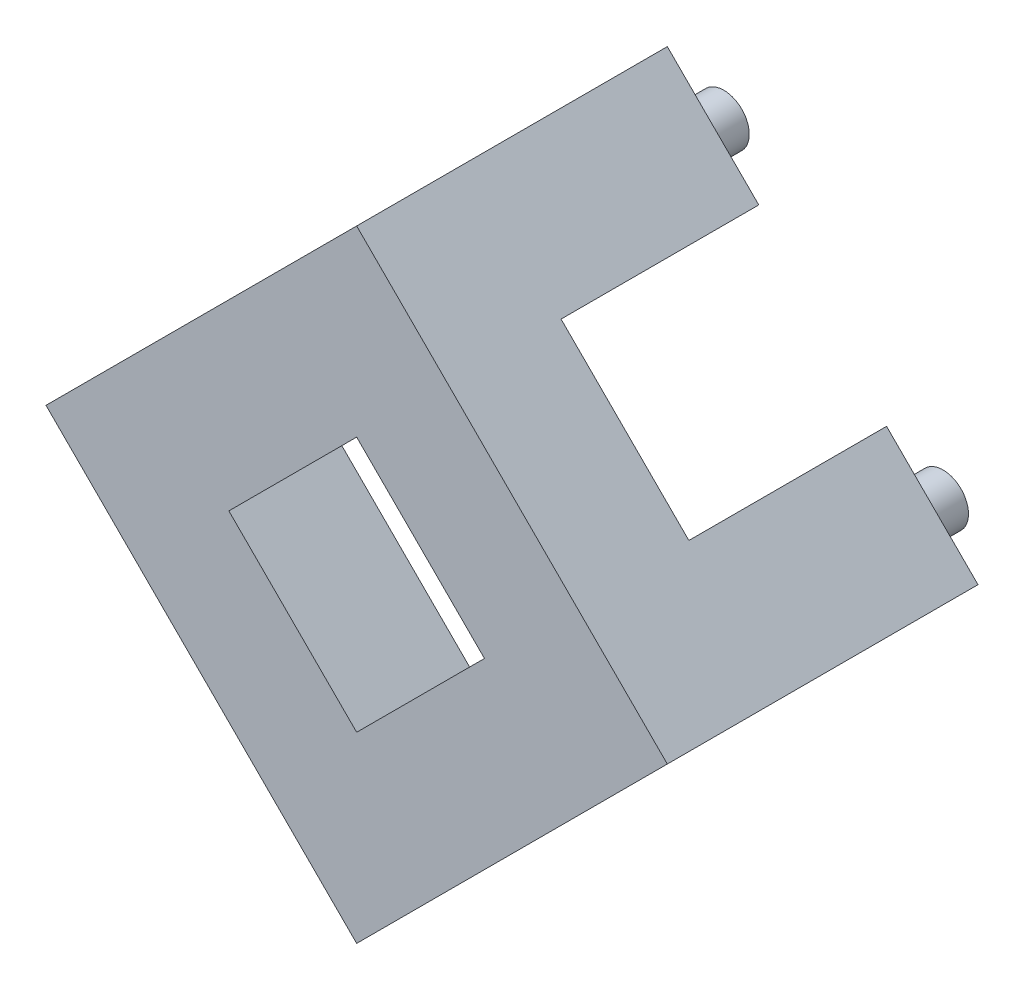
ISO-10303-21;
HEADER;
FILE_DESCRIPTION(('STEP AP214'),'2;1');
FILE_NAME('part.step','',(''),(''),'','','');
FILE_SCHEMA(('AUTOMOTIVE_DESIGN { 1 0 10303 214 1 1 1 1 }'));
ENDSEC;
DATA;
#1=APPLICATION_CONTEXT('core data for automotive mechanical design processes');
#2=APPLICATION_PROTOCOL_DEFINITION('international standard','automotive_design',2000,#1);
#3=PRODUCT_CONTEXT('',#1,'mechanical');
#4=PRODUCT('Part','Part','',(#3));
#5=PRODUCT_RELATED_PRODUCT_CATEGORY('part','',(#4));
#6=PRODUCT_DEFINITION_FORMATION('','',#4);
#7=PRODUCT_DEFINITION_CONTEXT('part definition',#1,'design');
#8=PRODUCT_DEFINITION('design','',#6,#7);
#9=PRODUCT_DEFINITION_SHAPE('','',#8);
#10=(LENGTH_UNIT() NAMED_UNIT(*) SI_UNIT(.MILLI.,.METRE.));
#11=(NAMED_UNIT(*) PLANE_ANGLE_UNIT() SI_UNIT($,.RADIAN.));
#12=(NAMED_UNIT(*) SI_UNIT($,.STERADIAN.) SOLID_ANGLE_UNIT());
#13=UNCERTAINTY_MEASURE_WITH_UNIT(LENGTH_MEASURE(1.E-05),#10,'distance_accuracy_value','');
#14=(GEOMETRIC_REPRESENTATION_CONTEXT(3) GLOBAL_UNCERTAINTY_ASSIGNED_CONTEXT((#13)) GLOBAL_UNIT_ASSIGNED_CONTEXT((#10,
#11,#12)) REPRESENTATION_CONTEXT('',''));
#15=CARTESIAN_POINT('',(0.,0.,0.));
#16=DIRECTION('',(0.,0.,1.));
#17=DIRECTION('',(1.,0.,0.));
#18=AXIS2_PLACEMENT_3D('',#15,#16,#17);
#19=CARTESIAN_POINT('',(-11.3137084989847,11.3137084989796,45.));
#20=DIRECTION('',(-0.707106781186707,0.707106781186388,0.));
#21=DIRECTION('',(-0.707106781186388,-0.707106781186707,0.));
#22=AXIS2_PLACEMENT_3D('',#19,#20,#21);
#23=PLANE('',#22);
#24=DIRECTION('',(0.,0.,1.));
#25=VECTOR('',#24,1.);
#26=CARTESIAN_POINT('',(-22.6274169979659,-6.74113542764587E-12,45.));
#27=LINE('',#26,#25);
#28=CARTESIAN_POINT('',(-22.6274169979659,-6.74113542764587E-12,45.));
#29=VERTEX_POINT('',#28);
#30=CARTESIAN_POINT('',(-22.6274169979659,-6.74113542764587E-12,65.));
#31=VERTEX_POINT('',#30);
#32=EDGE_CURVE('E414',#29,#31,#27,.T.);
#33=ORIENTED_EDGE('',*,*,#32,.F.);
#34=DIRECTION('',(-0.707106781186388,-0.707106781186707,0.));
#35=VECTOR('',#34,1.);
#36=CARTESIAN_POINT('',(-11.3137084989847,11.3137084989796,45.));
#37=LINE('',#36,#35);
#38=CARTESIAN_POINT('',(0.,22.6274169979694,45.));
#39=VERTEX_POINT('',#38);
#40=EDGE_CURVE('E275',#39,#29,#37,.T.);
#41=ORIENTED_EDGE('',*,*,#40,.F.);
#42=DIRECTION('',(0.,0.,1.));
#43=VECTOR('',#42,1.);
#44=CARTESIAN_POINT('',(0.,22.6274169979694,45.));
#45=LINE('',#44,#43);
#46=CARTESIAN_POINT('',(0.,22.6274169979694,65.));
#47=VERTEX_POINT('',#46);
#48=EDGE_CURVE('E279',#39,#47,#45,.T.);
#49=ORIENTED_EDGE('',*,*,#48,.T.);
#50=DIRECTION('',(-0.707106781186388,-0.707106781186707,0.));
#51=VECTOR('',#50,1.);
#52=CARTESIAN_POINT('',(-11.3137084989847,11.3137084989796,65.));
#53=LINE('',#52,#51);
#54=EDGE_CURVE('E269',#47,#31,#53,.T.);
#55=ORIENTED_EDGE('',*,*,#54,.T.);
#56=EDGE_LOOP('',(#33,#41,#49,#55));
#57=FACE_BOUND('',#56,.T.);
#58=ADVANCED_FACE('F107',(#57),#23,.F.);
#59=DIRECTION('',(0.707106781186786,0.707106781186309,0.));
#60=VECTOR('',#59,1.);
#61=CARTESIAN_POINT('',(-11.313708498972,11.3137084989796,45.));
#62=LINE('',#61,#60);
#63=CARTESIAN_POINT('',(-38.8137084989867,-16.1862915010166,45.));
#64=VERTEX_POINT('',#63);
#65=EDGE_CURVE('E238',#64,#29,#62,.T.);
#66=ORIENTED_EDGE('',*,*,#65,.F.);
#67=DIRECTION('',(0.,0.,1.));
#68=VECTOR('',#67,1.);
#69=CARTESIAN_POINT('',(-38.8137084989813,-16.186291501022,-35.7817459305204));
#70=LINE('',#69,#68);
#71=CARTESIAN_POINT('',(-38.8137084989813,-16.186291501022,10.));
#72=VERTEX_POINT('',#71);
#73=EDGE_CURVE('E249',#72,#64,#70,.T.);
#74=ORIENTED_EDGE('',*,*,#73,.F.);
#75=DIRECTION('',(-0.70710678118655,-0.707106781186545,0.));
#76=VECTOR('',#75,1.);
#77=CARTESIAN_POINT('',(-38.8137084989813,-16.186291501022,10.));
#78=LINE('',#77,#76);
#79=CARTESIAN_POINT('',(-22.6274169979659,-6.74227480844917E-12,10.));
#80=VERTEX_POINT('',#79);
#81=EDGE_CURVE('E267',#80,#72,#78,.T.);
#82=ORIENTED_EDGE('',*,*,#81,.F.);
#83=DIRECTION('',(0.,0.,1.));
#84=VECTOR('',#83,1.);
#85=CARTESIAN_POINT('',(-22.6274169979659,-6.74227480844917E-12,-35.7817459305204));
#86=LINE('',#85,#84);
#87=EDGE_CURVE('E251',#80,#29,#86,.T.);
#88=ORIENTED_EDGE('',*,*,#87,.T.);
#89=EDGE_LOOP('',(#66,#74,#82,#88));
#90=FACE_BOUND('',#89,.T.);
#91=ADVANCED_FACE('F247',(#90),#23,.F.);
#92=CARTESIAN_POINT('',(11.3137084989915,-11.3137084989864,45.));
#93=DIRECTION('',(0.707106781186707,-0.707106781186388,0.));
#94=DIRECTION('',(0.707106781186388,0.707106781186707,0.));
#95=AXIS2_PLACEMENT_3D('',#92,#93,#94);
#96=PLANE('',#95);
#97=DIRECTION('',(0.,0.,1.));
#98=VECTOR('',#97,1.);
#99=CARTESIAN_POINT('',(1.02123171030755E-11,-22.6274169979727,45.));
#100=LINE('',#99,#98);
#101=CARTESIAN_POINT('',(1.02123171030755E-11,-22.6274169979727,45.));
#102=VERTEX_POINT('',#101);
#103=CARTESIAN_POINT('',(1.02123171030755E-11,-22.6274169979727,65.));
#104=VERTEX_POINT('',#103);
#105=EDGE_CURVE('E122',#102,#104,#100,.T.);
#106=ORIENTED_EDGE('',*,*,#105,.T.);
#107=DIRECTION('',(0.707106781186388,0.707106781186707,0.));
#108=VECTOR('',#107,1.);
#109=CARTESIAN_POINT('',(11.3137084989915,-11.3137084989864,65.));
#110=LINE('',#109,#108);
#111=CARTESIAN_POINT('',(22.627416997971,-1.73472347597681E-12,65.));
#112=VERTEX_POINT('',#111);
#113=EDGE_CURVE('E417',#104,#112,#110,.T.);
#114=ORIENTED_EDGE('',*,*,#113,.T.);
#115=DIRECTION('',(0.,0.,1.));
#116=VECTOR('',#115,1.);
#117=CARTESIAN_POINT('',(22.6274169979762,3.4555691641458E-12,45.));
#118=LINE('',#117,#116);
#119=CARTESIAN_POINT('',(22.6274169979762,3.4555691641458E-12,45.));
#120=VERTEX_POINT('',#119);
#121=EDGE_CURVE('E263',#120,#112,#118,.T.);
#122=ORIENTED_EDGE('',*,*,#121,.F.);
#123=DIRECTION('',(0.707106781186388,0.707106781186707,0.));
#124=VECTOR('',#123,1.);
#125=CARTESIAN_POINT('',(11.3137084989915,-11.3137084989864,45.));
#126=LINE('',#125,#124);
#127=EDGE_CURVE('E423',#102,#120,#126,.T.);
#128=ORIENTED_EDGE('',*,*,#127,.F.);
#129=EDGE_LOOP('',(#106,#114,#122,#128));
#130=FACE_BOUND('',#129,.T.);
#131=ADVANCED_FACE('F474',(#130),#96,.F.);
#132=DIRECTION('',(-0.707106781186544,-0.707106781186551,0.));
#133=VECTOR('',#132,1.);
#134=CARTESIAN_POINT('',(11.3137084989915,-11.3137084989913,45.));
#135=LINE('',#134,#133);
#136=CARTESIAN_POINT('',(-16.186291501005,-38.813708498988,45.));
#137=VERTEX_POINT('',#136);
#138=EDGE_CURVE('E240',#102,#137,#135,.T.);
#139=ORIENTED_EDGE('',*,*,#138,.F.);
#140=DIRECTION('',(0.,0.,1.));
#141=VECTOR('',#140,1.);
#142=CARTESIAN_POINT('',(1.02103323420298E-11,-22.6274169979727,-35.7817459305204));
#143=LINE('',#142,#141);
#144=CARTESIAN_POINT('',(1.02103323420298E-11,-22.6274169979727,10.));
#145=VERTEX_POINT('',#144);
#146=EDGE_CURVE('E403',#145,#102,#143,.T.);
#147=ORIENTED_EDGE('',*,*,#146,.F.);
#148=DIRECTION('',(0.707106781186544,0.707106781186551,0.));
#149=VECTOR('',#148,1.);
#150=CARTESIAN_POINT('',(1.02103323420298E-11,-22.6274169979727,10.));
#151=LINE('',#150,#149);
#152=CARTESIAN_POINT('',(-16.186291501005,-38.813708498988,10.));
#153=VERTEX_POINT('',#152);
#154=EDGE_CURVE('E400',#153,#145,#151,.T.);
#155=ORIENTED_EDGE('',*,*,#154,.F.);
#156=DIRECTION('',(0.,0.,1.));
#157=VECTOR('',#156,1.);
#158=CARTESIAN_POINT('',(-16.186291501005,-38.813708498988,-35.7817459305204));
#159=LINE('',#158,#157);
#160=EDGE_CURVE('E130',#153,#137,#159,.T.);
#161=ORIENTED_EDGE('',*,*,#160,.T.);
#162=EDGE_LOOP('',(#139,#147,#155,#161));
#163=FACE_BOUND('',#162,.T.);
#164=ADVANCED_FACE('F527',(#163),#96,.F.);
#165=CARTESIAN_POINT('',(-16.1862915010152,38.8137084989848,-35.7817459305204));
#166=DIRECTION('',(-0.70710678118655,-0.707106781186545,0.));
#167=DIRECTION('',(0.707106781186545,-0.70710678118655,0.));
#168=AXIS2_PLACEMENT_3D('',#165,#166,#167);
#169=PLANE('',#168);
#170=DIRECTION('',(-0.707106781186707,0.707106781186388,0.));
#171=VECTOR('',#170,1.);
#172=CARTESIAN_POINT('',(11.3137084989847,11.3137084989898,45.));
#173=LINE('',#172,#171);
#174=EDGE_CURVE('E306',#120,#39,#173,.T.);
#175=ORIENTED_EDGE('',*,*,#174,.F.);
#176=ORIENTED_EDGE('',*,*,#121,.T.);
#177=DIRECTION('',(0.707106781186545,-0.70710678118655,0.));
#178=VECTOR('',#177,1.);
#179=CARTESIAN_POINT('',(-16.1862915010152,38.8137084989848,65.));
#180=LINE('',#179,#178);
#181=EDGE_CURVE('E323',#47,#112,#180,.T.);
#182=ORIENTED_EDGE('',*,*,#181,.F.);
#183=ORIENTED_EDGE('',*,*,#48,.F.);
#184=EDGE_LOOP('',(#175,#176,#182,#183));
#185=FACE_BOUND('',#184,.T.);
#186=ADVANCED_FACE('F451',(#185),#169,.T.);
#187=DIRECTION('',(0.,0.,1.));
#188=VECTOR('',#187,1.);
#189=CARTESIAN_POINT('',(38.8137084989915,-16.1862915010117,-35.7817459305204));
#190=LINE('',#189,#188);
#191=CARTESIAN_POINT('',(38.8137084989915,-16.1862915010117,10.));
#192=VERTEX_POINT('',#191);
#193=CARTESIAN_POINT('',(38.8137084989915,-16.1862915010117,45.));
#194=VERTEX_POINT('',#193);
#195=EDGE_CURVE('E298',#192,#194,#190,.T.);
#196=ORIENTED_EDGE('',*,*,#195,.T.);
#197=DIRECTION('',(-0.707106781186551,0.707106781186544,0.));
#198=VECTOR('',#197,1.);
#199=CARTESIAN_POINT('',(11.3137084989897,11.3137084989898,45.));
#200=LINE('',#199,#198);
#201=EDGE_CURVE('E421',#194,#120,#200,.T.);
#202=ORIENTED_EDGE('',*,*,#201,.T.);
#203=DIRECTION('',(0.,0.,1.));
#204=VECTOR('',#203,1.);
#205=CARTESIAN_POINT('',(22.6274169979762,3.45046803861719E-12,-35.7817459305204));
#206=LINE('',#205,#204);
#207=CARTESIAN_POINT('',(22.6274169979762,3.45046803861719E-12,10.));
#208=VERTEX_POINT('',#207);
#209=EDGE_CURVE('E300',#208,#120,#206,.T.);
#210=ORIENTED_EDGE('',*,*,#209,.F.);
#211=DIRECTION('',(-0.707106781186551,0.707106781186544,0.));
#212=VECTOR('',#211,1.);
#213=CARTESIAN_POINT('',(22.6274169979762,3.45046803861719E-12,10.));
#214=LINE('',#213,#212);
#215=EDGE_CURVE('E288',#192,#208,#214,.T.);
#216=ORIENTED_EDGE('',*,*,#215,.F.);
#217=EDGE_LOOP('',(#196,#202,#210,#216));
#218=FACE_BOUND('',#217,.T.);
#219=ADVANCED_FACE('F526',(#218),#169,.T.);
#220=DIRECTION('',(0.,0.,1.));
#221=VECTOR('',#220,1.);
#222=CARTESIAN_POINT('',(0.,22.6274169979694,-35.7817459305204));
#223=LINE('',#222,#221);
#224=CARTESIAN_POINT('',(0.,22.6274169979694,10.));
#225=VERTEX_POINT('',#224);
#226=EDGE_CURVE('E336',#225,#39,#223,.T.);
#227=ORIENTED_EDGE('',*,*,#226,.T.);
#228=DIRECTION('',(0.707106781186545,-0.70710678118655,0.));
#229=VECTOR('',#228,1.);
#230=CARTESIAN_POINT('',(11.3137084989847,11.3137084989846,45.));
#231=LINE('',#230,#229);
#232=CARTESIAN_POINT('',(-16.1862915010152,38.8137084989848,45.));
#233=VERTEX_POINT('',#232);
#234=EDGE_CURVE('E277',#233,#39,#231,.T.);
#235=ORIENTED_EDGE('',*,*,#234,.F.);
#236=DIRECTION('',(0.,0.,1.));
#237=VECTOR('',#236,1.);
#238=CARTESIAN_POINT('',(-16.1862915010152,38.8137084989848,-35.7817459305204));
#239=LINE('',#238,#237);
#240=CARTESIAN_POINT('',(-16.1862915010152,38.8137084989848,10.));
#241=VERTEX_POINT('',#240);
#242=EDGE_CURVE('E339',#241,#233,#239,.T.);
#243=ORIENTED_EDGE('',*,*,#242,.F.);
#244=DIRECTION('',(-0.707106781186545,0.70710678118655,0.));
#245=VECTOR('',#244,1.);
#246=CARTESIAN_POINT('',(-16.1862915010152,38.8137084989848,10.));
#247=LINE('',#246,#245);
#248=EDGE_CURVE('E327',#225,#241,#247,.T.);
#249=ORIENTED_EDGE('',*,*,#248,.F.);
#250=EDGE_LOOP('',(#227,#235,#243,#249));
#251=FACE_BOUND('',#250,.T.);
#252=ADVANCED_FACE('F379',(#251),#169,.T.);
#253=CARTESIAN_POINT('',(16.1862915010155,38.8137084989848,-35.7817459305204));
#254=DIRECTION('',(0.707106781186541,0.707106781186555,0.));
#255=DIRECTION('',(-0.707106781186555,0.707106781186541,0.));
#256=AXIS2_PLACEMENT_3D('',#253,#254,#255);
#257=PLANE('',#256);
#258=DIRECTION('',(0.707106781186555,-0.707106781186541,0.));
#259=VECTOR('',#258,1.);
#260=CARTESIAN_POINT('',(16.1862915010155,38.8137084989848,10.));
#261=LINE('',#260,#259);
#262=CARTESIAN_POINT('',(0.,55.,10.));
#263=VERTEX_POINT('',#262);
#264=CARTESIAN_POINT('',(16.1862915010155,38.8137084989848,10.));
#265=VERTEX_POINT('',#264);
#266=EDGE_CURVE('E332',#263,#265,#261,.T.);
#267=ORIENTED_EDGE('',*,*,#266,.F.);
#268=DIRECTION('',(0.,0.,1.));
#269=VECTOR('',#268,1.);
#270=CARTESIAN_POINT('',(0.,55.,-35.7817459305204));
#271=LINE('',#270,#269);
#272=CARTESIAN_POINT('',(0.,55.,65.));
#273=VERTEX_POINT('',#272);
#274=EDGE_CURVE('E326',#263,#273,#271,.T.);
#275=ORIENTED_EDGE('',*,*,#274,.T.);
#276=DIRECTION('',(-0.707106781186554,0.707106781186541,0.));
#277=VECTOR('',#276,1.);
#278=CARTESIAN_POINT('',(16.1862915010155,38.8137084989848,65.));
#279=LINE('',#278,#277);
#280=CARTESIAN_POINT('',(55.0000000000067,3.45933972717764E-12,65.));
#281=VERTEX_POINT('',#280);
#282=EDGE_CURVE('E318',#281,#273,#279,.T.);
#283=ORIENTED_EDGE('',*,*,#282,.F.);
#284=DIRECTION('',(0.,0.,1.));
#285=VECTOR('',#284,1.);
#286=CARTESIAN_POINT('',(55.0000000000067,3.45933972717764E-12,-35.7817459305204));
#287=LINE('',#286,#285);
#288=CARTESIAN_POINT('',(55.0000000000067,3.46250805804971E-12,10.));
#289=VERTEX_POINT('',#288);
#290=EDGE_CURVE('E291',#289,#281,#287,.T.);
#291=ORIENTED_EDGE('',*,*,#290,.F.);
#292=DIRECTION('',(0.707106781186548,-0.707106781186548,0.));
#293=VECTOR('',#292,1.);
#294=CARTESIAN_POINT('',(55.0000000000067,3.45933972717764E-12,10.));
#295=LINE('',#294,#293);
#296=CARTESIAN_POINT('',(38.8137084989915,16.1862915010187,10.));
#297=VERTEX_POINT('',#296);
#298=EDGE_CURVE('E293',#297,#289,#295,.T.);
#299=ORIENTED_EDGE('',*,*,#298,.F.);
#300=DIRECTION('',(0.,0.,1.));
#301=VECTOR('',#300,1.);
#302=CARTESIAN_POINT('',(38.8137084989915,16.1862915010187,-35.7817459305204));
#303=LINE('',#302,#301);
#304=CARTESIAN_POINT('',(38.8137084989915,16.1862915010187,45.));
#305=VERTEX_POINT('',#304);
#306=EDGE_CURVE('E287',#297,#305,#303,.T.);
#307=ORIENTED_EDGE('',*,*,#306,.T.);
#308=DIRECTION('',(0.707106781186702,-0.707106781186393,0.));
#309=VECTOR('',#308,1.);
#310=CARTESIAN_POINT('',(27.4999999999966,27.5000000000086,45.));
#311=LINE('',#310,#309);
#312=CARTESIAN_POINT('',(16.1862915010155,38.8137084989848,45.));
#313=VERTEX_POINT('',#312);
#314=EDGE_CURVE('E312',#313,#305,#311,.T.);
#315=ORIENTED_EDGE('',*,*,#314,.F.);
#316=DIRECTION('',(0.,0.,1.));
#317=VECTOR('',#316,1.);
#318=CARTESIAN_POINT('',(16.1862915010155,38.8137084989848,-35.7817459305204));
#319=LINE('',#318,#317);
#320=EDGE_CURVE('E330',#265,#313,#319,.T.);
#321=ORIENTED_EDGE('',*,*,#320,.F.);
#322=EDGE_LOOP('',(#267,#275,#283,#291,#299,#307,#315,#321));
#323=FACE_BOUND('',#322,.T.);
#324=ADVANCED_FACE('F109',(#323),#257,.T.);
#325=CARTESIAN_POINT('',(0.,22.6274169979694,-35.7817459305204));
#326=DIRECTION('',(0.707106781186545,-0.70710678118655,0.));
#327=DIRECTION('',(0.70710678118655,0.707106781186545,0.));
#328=AXIS2_PLACEMENT_3D('',#325,#326,#327);
#329=PLANE('',#328);
#330=DIRECTION('',(0.70710678118655,0.707106781186545,0.));
#331=VECTOR('',#330,1.);
#332=CARTESIAN_POINT('',(-11.3137084989847,11.3137084989848,45.));
#333=LINE('',#332,#331);
#334=EDGE_CURVE('E315',#39,#313,#333,.T.);
#335=ORIENTED_EDGE('',*,*,#334,.F.);
#336=ORIENTED_EDGE('',*,*,#226,.F.);
#337=DIRECTION('',(-0.70710678118655,-0.707106781186545,0.));
#338=VECTOR('',#337,1.);
#339=CARTESIAN_POINT('',(0.,22.6274169979694,10.));
#340=LINE('',#339,#338);
#341=EDGE_CURVE('E329',#265,#225,#340,.T.);
#342=ORIENTED_EDGE('',*,*,#341,.F.);
#343=ORIENTED_EDGE('',*,*,#320,.T.);
#344=EDGE_LOOP('',(#335,#336,#342,#343));
#345=FACE_BOUND('',#344,.T.);
#346=ADVANCED_FACE('F370',(#345),#329,.T.);
#347=CARTESIAN_POINT('',(0.,55.,-35.7817459305204));
#348=DIRECTION('',(-0.707106781186548,0.707106781186547,0.));
#349=DIRECTION('',(-0.707106781186547,-0.707106781186548,0.));
#350=AXIS2_PLACEMENT_3D('',#347,#348,#349);
#351=PLANE('',#350);
#352=DIRECTION('',(0.707106781186547,0.707106781186548,0.));
#353=VECTOR('',#352,1.);
#354=CARTESIAN_POINT('',(0.,55.,10.));
#355=LINE('',#354,#353);
#356=EDGE_CURVE('E334',#241,#263,#355,.T.);
#357=ORIENTED_EDGE('',*,*,#356,.F.);
#358=ORIENTED_EDGE('',*,*,#242,.T.);
#359=DIRECTION('',(0.707106781186387,0.707106781186708,0.));
#360=VECTOR('',#359,1.);
#361=CARTESIAN_POINT('',(-27.5000000000037,27.4999999999912,45.));
#362=LINE('',#361,#360);
#363=CARTESIAN_POINT('',(-38.8137084989813,16.1862915010084,45.));
#364=VERTEX_POINT('',#363);
#365=EDGE_CURVE('E270',#364,#233,#362,.T.);
#366=ORIENTED_EDGE('',*,*,#365,.F.);
#367=DIRECTION('',(0.,0.,1.));
#368=VECTOR('',#367,1.);
#369=CARTESIAN_POINT('',(-38.8137084989813,16.1862915010084,-35.7817459305204));
#370=LINE('',#369,#368);
#371=CARTESIAN_POINT('',(-38.8137084989813,16.1862915010084,10.));
#372=VERTEX_POINT('',#371);
#373=EDGE_CURVE('E261',#372,#364,#370,.T.);
#374=ORIENTED_EDGE('',*,*,#373,.F.);
#375=DIRECTION('',(0.707106781186548,0.707106781186547,0.));
#376=VECTOR('',#375,1.);
#377=CARTESIAN_POINT('',(-38.8137084989813,16.1862915010084,10.));
#378=LINE('',#377,#376);
#379=CARTESIAN_POINT('',(-54.9999999999965,-6.75848266240564E-12,10.));
#380=VERTEX_POINT('',#379);
#381=EDGE_CURVE('E434',#380,#372,#378,.T.);
#382=ORIENTED_EDGE('',*,*,#381,.F.);
#383=DIRECTION('',(0.,0.,1.));
#384=VECTOR('',#383,1.);
#385=CARTESIAN_POINT('',(-54.9999999999965,-6.75511099502498E-12,-35.7817459305204));
#386=LINE('',#385,#384);
#387=CARTESIAN_POINT('',(-54.9999999999965,-6.75511099502498E-12,65.));
#388=VERTEX_POINT('',#387);
#389=EDGE_CURVE('E395',#380,#388,#386,.T.);
#390=ORIENTED_EDGE('',*,*,#389,.T.);
#391=DIRECTION('',(-0.707106781186547,-0.707106781186548,0.));
#392=VECTOR('',#391,1.);
#393=CARTESIAN_POINT('',(0.,55.,65.));
#394=LINE('',#393,#392);
#395=EDGE_CURVE('E321',#273,#388,#394,.T.);
#396=ORIENTED_EDGE('',*,*,#395,.F.);
#397=ORIENTED_EDGE('',*,*,#274,.F.);
#398=EDGE_LOOP('',(#357,#358,#366,#374,#382,#390,#396,#397));
#399=FACE_BOUND('',#398,.T.);
#400=ADVANCED_FACE('F358',(#399),#351,.T.);
#401=CARTESIAN_POINT('',(0.,0.,10.));
#402=DIRECTION('',(0.,0.,1.));
#403=DIRECTION('',(1.,0.,0.));
#404=AXIS2_PLACEMENT_3D('',#401,#402,#403);
#405=PLANE('',#404);
#406=CARTESIAN_POINT('',(0.,38.8137084989848,10.));
#407=DIRECTION('',(0.,0.,1.));
#408=DIRECTION('',(1.,0.,0.));
#409=AXIS2_PLACEMENT_3D('',#406,#407,#408);
#410=CIRCLE('',#409,4.5);
#411=CARTESIAN_POINT('',(4.49999999999998,38.8137084989848,10.));
#412=VERTEX_POINT('',#411);
#413=EDGE_CURVE('E115',#412,#412,#410,.F.);
#414=ORIENTED_EDGE('',*,*,#413,.F.);
#415=EDGE_LOOP('',(#414));
#416=FACE_BOUND('',#415,.T.);
#417=ORIENTED_EDGE('',*,*,#266,.T.);
#418=ORIENTED_EDGE('',*,*,#341,.T.);
#419=ORIENTED_EDGE('',*,*,#248,.T.);
#420=ORIENTED_EDGE('',*,*,#356,.T.);
#421=EDGE_LOOP('',(#417,#418,#419,#420));
#422=FACE_BOUND('',#421,.T.);
#423=ADVANCED_FACE('F354',(#416,#422),#405,.F.);
#424=CARTESIAN_POINT('',(0.,0.,65.));
#425=DIRECTION('',(0.,0.,1.));
#426=DIRECTION('',(1.,0.,0.));
#427=AXIS2_PLACEMENT_3D('',#424,#425,#426);
#428=PLANE('',#427);
#429=DIRECTION('',(0.707106781186707,-0.707106781186388,0.));
#430=VECTOR('',#429,1.);
#431=CARTESIAN_POINT('',(-11.3137084989812,-11.3137084989863,65.));
#432=LINE('',#431,#430);
#433=EDGE_CURVE('E253',#31,#104,#432,.T.);
#434=ORIENTED_EDGE('',*,*,#433,.F.);
#435=ORIENTED_EDGE('',*,*,#54,.F.);
#436=ORIENTED_EDGE('',*,*,#181,.T.);
#437=ORIENTED_EDGE('',*,*,#113,.F.);
#438=EDGE_LOOP('',(#434,#435,#436,#437));
#439=FACE_BOUND('',#438,.T.);
#440=ORIENTED_EDGE('',*,*,#282,.T.);
#441=ORIENTED_EDGE('',*,*,#395,.T.);
#442=DIRECTION('',(0.707106781186548,-0.707106781186547,0.));
#443=VECTOR('',#442,1.);
#444=CARTESIAN_POINT('',(-54.9999999999965,-6.75511099502498E-12,65.));
#445=LINE('',#444,#443);
#446=CARTESIAN_POINT('',(1.02211862795979E-11,-55.0000000000033,65.));
#447=VERTEX_POINT('',#446);
#448=EDGE_CURVE('E259',#388,#447,#445,.T.);
#449=ORIENTED_EDGE('',*,*,#448,.T.);
#450=DIRECTION('',(0.707106781186548,0.707106781186547,0.));
#451=VECTOR('',#450,1.);
#452=CARTESIAN_POINT('',(38.8137084989915,-16.1862915010117,65.));
#453=LINE('',#452,#451);
#454=EDGE_CURVE('E284',#447,#281,#453,.T.);
#455=ORIENTED_EDGE('',*,*,#454,.T.);
#456=EDGE_LOOP('',(#440,#441,#449,#455));
#457=FACE_BOUND('',#456,.T.);
#458=ADVANCED_FACE('F357',(#439,#457),#428,.T.);
#459=CARTESIAN_POINT('',(0.,0.,45.));
#460=DIRECTION('',(0.,0.,1.));
#461=DIRECTION('',(1.,0.,0.));
#462=AXIS2_PLACEMENT_3D('',#459,#460,#461);
#463=PLANE('',#462);
#464=ORIENTED_EDGE('',*,*,#174,.T.);
#465=ORIENTED_EDGE('',*,*,#334,.T.);
#466=ORIENTED_EDGE('',*,*,#314,.T.);
#467=DIRECTION('',(-0.707106781186551,-0.707106781186545,0.));
#468=VECTOR('',#467,1.);
#469=CARTESIAN_POINT('',(11.3137084989863,-11.3137084989864,45.));
#470=LINE('',#469,#468);
#471=EDGE_CURVE('E309',#305,#120,#470,.T.);
#472=ORIENTED_EDGE('',*,*,#471,.T.);
#473=EDGE_LOOP('',(#464,#465,#466,#472));
#474=FACE_BOUND('',#473,.T.);
#475=ADVANCED_FACE('F375',(#474),#463,.F.);
#476=CARTESIAN_POINT('',(38.8137084989915,16.1862915010187,-35.7817459305204));
#477=DIRECTION('',(-0.707106781186545,0.70710678118655,0.));
#478=DIRECTION('',(-0.70710678118655,-0.707106781186545,0.));
#479=AXIS2_PLACEMENT_3D('',#476,#477,#478);
#480=PLANE('',#479);
#481=ORIENTED_EDGE('',*,*,#471,.F.);
#482=ORIENTED_EDGE('',*,*,#306,.F.);
#483=DIRECTION('',(0.70710678118655,0.707106781186545,0.));
#484=VECTOR('',#483,1.);
#485=CARTESIAN_POINT('',(38.8137084989915,16.1862915010187,10.));
#486=LINE('',#485,#484);
#487=EDGE_CURVE('E295',#208,#297,#486,.T.);
#488=ORIENTED_EDGE('',*,*,#487,.F.);
#489=ORIENTED_EDGE('',*,*,#209,.T.);
#490=EDGE_LOOP('',(#481,#482,#488,#489));
#491=FACE_BOUND('',#490,.T.);
#492=ADVANCED_FACE('F515',(#491),#480,.T.);
#493=CARTESIAN_POINT('',(38.8137084989915,-16.1862915010117,-35.7817459305204));
#494=DIRECTION('',(0.707106781186547,-0.707106781186548,0.));
#495=DIRECTION('',(0.707106781186548,0.707106781186547,0.));
#496=AXIS2_PLACEMENT_3D('',#493,#494,#495);
#497=PLANE('',#496);
#498=DIRECTION('',(-0.707106781186548,-0.707106781186547,0.));
#499=VECTOR('',#498,1.);
#500=CARTESIAN_POINT('',(38.8137084989915,-16.1862915010117,10.));
#501=LINE('',#500,#499);
#502=EDGE_CURVE('E290',#289,#192,#501,.T.);
#503=ORIENTED_EDGE('',*,*,#502,.F.);
#504=ORIENTED_EDGE('',*,*,#290,.T.);
#505=ORIENTED_EDGE('',*,*,#454,.F.);
#506=DIRECTION('',(0.,0.,1.));
#507=VECTOR('',#506,1.);
#508=CARTESIAN_POINT('',(1.02211862795979E-11,-55.0000000000033,-35.7817459305204));
#509=LINE('',#508,#507);
#510=CARTESIAN_POINT('',(1.02244601674073E-11,-55.0000000000033,10.));
#511=VERTEX_POINT('',#510);
#512=EDGE_CURVE('E397',#511,#447,#509,.T.);
#513=ORIENTED_EDGE('',*,*,#512,.F.);
#514=DIRECTION('',(-0.707106781186548,-0.707106781186548,0.));
#515=VECTOR('',#514,1.);
#516=CARTESIAN_POINT('',(1.02211862795979E-11,-55.0000000000033,10.));
#517=LINE('',#516,#515);
#518=CARTESIAN_POINT('',(16.1862915010254,-38.813708498988,10.));
#519=VERTEX_POINT('',#518);
#520=EDGE_CURVE('E406',#519,#511,#517,.T.);
#521=ORIENTED_EDGE('',*,*,#520,.F.);
#522=DIRECTION('',(0.,0.,1.));
#523=VECTOR('',#522,1.);
#524=CARTESIAN_POINT('',(16.1862915010254,-38.813708498988,-35.7817459305204));
#525=LINE('',#524,#523);
#526=CARTESIAN_POINT('',(16.1862915010254,-38.813708498988,45.));
#527=VERTEX_POINT('',#526);
#528=EDGE_CURVE('E411',#519,#527,#525,.T.);
#529=ORIENTED_EDGE('',*,*,#528,.T.);
#530=DIRECTION('',(-0.707106781186388,-0.707106781186707,0.));
#531=VECTOR('',#530,1.);
#532=CARTESIAN_POINT('',(27.5000000000104,-27.499999999998,45.));
#533=LINE('',#532,#531);
#534=EDGE_CURVE('E418',#194,#527,#533,.T.);
#535=ORIENTED_EDGE('',*,*,#534,.F.);
#536=ORIENTED_EDGE('',*,*,#195,.F.);
#537=EDGE_LOOP('',(#503,#504,#505,#513,#521,#529,#535,#536));
#538=FACE_BOUND('',#537,.T.);
#539=ADVANCED_FACE('F390',(#538),#497,.T.);
#540=CARTESIAN_POINT('',(0.,0.,10.));
#541=DIRECTION('',(0.,0.,1.));
#542=DIRECTION('',(1.,0.,0.));
#543=AXIS2_PLACEMENT_3D('',#540,#541,#542);
#544=PLANE('',#543);
#545=CARTESIAN_POINT('',(38.8137084989848,0.,10.));
#546=DIRECTION('',(0.,0.,1.));
#547=DIRECTION('',(1.,0.,0.));
#548=AXIS2_PLACEMENT_3D('',#545,#546,#547);
#549=CIRCLE('',#548,4.5);
#550=CARTESIAN_POINT('',(43.3137084989848,0.,10.));
#551=VERTEX_POINT('',#550);
#552=EDGE_CURVE('E347',#551,#551,#549,.F.);
#553=ORIENTED_EDGE('',*,*,#552,.F.);
#554=EDGE_LOOP('',(#553));
#555=FACE_BOUND('',#554,.T.);
#556=ORIENTED_EDGE('',*,*,#298,.T.);
#557=ORIENTED_EDGE('',*,*,#502,.T.);
#558=ORIENTED_EDGE('',*,*,#215,.T.);
#559=ORIENTED_EDGE('',*,*,#487,.T.);
#560=EDGE_LOOP('',(#556,#557,#558,#559));
#561=FACE_BOUND('',#560,.T.);
#562=ADVANCED_FACE('F509',(#555,#561),#544,.F.);
#563=CARTESIAN_POINT('',(0.,0.,45.));
#564=DIRECTION('',(0.,0.,1.));
#565=DIRECTION('',(1.,0.,0.));
#566=AXIS2_PLACEMENT_3D('',#563,#564,#565);
#567=PLANE('',#566);
#568=ORIENTED_EDGE('',*,*,#365,.T.);
#569=ORIENTED_EDGE('',*,*,#234,.T.);
#570=ORIENTED_EDGE('',*,*,#40,.T.);
#571=DIRECTION('',(-0.707106781186551,0.707106781186544,0.));
#572=VECTOR('',#571,1.);
#573=CARTESIAN_POINT('',(-11.3137084989862,-11.3137084989863,45.));
#574=LINE('',#573,#572);
#575=EDGE_CURVE('E272',#29,#364,#574,.T.);
#576=ORIENTED_EDGE('',*,*,#575,.T.);
#577=EDGE_LOOP('',(#568,#569,#570,#576));
#578=FACE_BOUND('',#577,.T.);
#579=ADVANCED_FACE('F444',(#578),#567,.F.);
#580=CARTESIAN_POINT('',(-22.6274169979659,-6.74227480844917E-12,-35.7817459305204));
#581=DIRECTION('',(0.707106781186544,0.707106781186551,0.));
#582=DIRECTION('',(-0.707106781186551,0.707106781186544,0.));
#583=AXIS2_PLACEMENT_3D('',#580,#581,#582);
#584=PLANE('',#583);
#585=ORIENTED_EDGE('',*,*,#575,.F.);
#586=ORIENTED_EDGE('',*,*,#87,.F.);
#587=DIRECTION('',(0.707106781186551,-0.707106781186544,0.));
#588=VECTOR('',#587,1.);
#589=CARTESIAN_POINT('',(-22.6274169979659,-6.74227480844917E-12,10.));
#590=LINE('',#589,#588);
#591=EDGE_CURVE('E432',#372,#80,#590,.T.);
#592=ORIENTED_EDGE('',*,*,#591,.F.);
#593=ORIENTED_EDGE('',*,*,#373,.T.);
#594=EDGE_LOOP('',(#585,#586,#592,#593));
#595=FACE_BOUND('',#594,.T.);
#596=ADVANCED_FACE('F441',(#595),#584,.T.);
#597=CARTESIAN_POINT('',(-54.9999999999965,-6.75511099502498E-12,-35.7817459305204));
#598=DIRECTION('',(-0.707106781186547,-0.707106781186548,0.));
#599=DIRECTION('',(0.707106781186548,-0.707106781186547,0.));
#600=AXIS2_PLACEMENT_3D('',#597,#598,#599);
#601=PLANE('',#600);
#602=DIRECTION('',(-0.707106781186548,0.707106781186547,0.));
#603=VECTOR('',#602,1.);
#604=CARTESIAN_POINT('',(-54.9999999999965,-6.75511099502498E-12,10.));
#605=LINE('',#604,#603);
#606=EDGE_CURVE('E258',#72,#380,#605,.T.);
#607=ORIENTED_EDGE('',*,*,#606,.F.);
#608=ORIENTED_EDGE('',*,*,#73,.T.);
#609=DIRECTION('',(-0.707106781186707,0.707106781186388,0.));
#610=VECTOR('',#609,1.);
#611=CARTESIAN_POINT('',(-27.4999999999929,-27.5000000000053,45.));
#612=LINE('',#611,#610);
#613=EDGE_CURVE('E234',#137,#64,#612,.T.);
#614=ORIENTED_EDGE('',*,*,#613,.F.);
#615=ORIENTED_EDGE('',*,*,#160,.F.);
#616=DIRECTION('',(-0.707106781186547,0.707106781186548,0.));
#617=VECTOR('',#616,1.);
#618=CARTESIAN_POINT('',(-16.186291501005,-38.813708498988,10.));
#619=LINE('',#618,#617);
#620=EDGE_CURVE('E398',#511,#153,#619,.T.);
#621=ORIENTED_EDGE('',*,*,#620,.F.);
#622=ORIENTED_EDGE('',*,*,#512,.T.);
#623=ORIENTED_EDGE('',*,*,#448,.F.);
#624=ORIENTED_EDGE('',*,*,#389,.F.);
#625=EDGE_LOOP('',(#607,#608,#614,#615,#621,#622,#623,#624));
#626=FACE_BOUND('',#625,.T.);
#627=ADVANCED_FACE('F256',(#626),#601,.T.);
#628=CARTESIAN_POINT('',(0.,0.,10.));
#629=DIRECTION('',(0.,0.,1.));
#630=DIRECTION('',(1.,0.,0.));
#631=AXIS2_PLACEMENT_3D('',#628,#629,#630);
#632=PLANE('',#631);
#633=CARTESIAN_POINT('',(-38.8137084989848,0.,10.));
#634=DIRECTION('',(0.,0.,1.));
#635=DIRECTION('',(1.,0.,0.));
#636=AXIS2_PLACEMENT_3D('',#633,#634,#635);
#637=CIRCLE('',#636,4.5);
#638=CARTESIAN_POINT('',(-34.3137084989848,0.,10.));
#639=VERTEX_POINT('',#638);
#640=EDGE_CURVE('E12',#639,#639,#637,.F.);
#641=ORIENTED_EDGE('',*,*,#640,.F.);
#642=EDGE_LOOP('',(#641));
#643=FACE_BOUND('',#642,.T.);
#644=ORIENTED_EDGE('',*,*,#606,.T.);
#645=ORIENTED_EDGE('',*,*,#381,.T.);
#646=ORIENTED_EDGE('',*,*,#591,.T.);
#647=ORIENTED_EDGE('',*,*,#81,.T.);
#648=EDGE_LOOP('',(#644,#645,#646,#647));
#649=FACE_BOUND('',#648,.T.);
#650=ADVANCED_FACE('F577',(#643,#649),#632,.F.);
#651=CARTESIAN_POINT('',(0.,0.,45.));
#652=DIRECTION('',(0.,0.,1.));
#653=DIRECTION('',(1.,0.,0.));
#654=AXIS2_PLACEMENT_3D('',#651,#652,#653);
#655=PLANE('',#654);
#656=ORIENTED_EDGE('',*,*,#534,.T.);
#657=DIRECTION('',(-0.707106781186545,0.70710678118655,0.));
#658=VECTOR('',#657,1.);
#659=CARTESIAN_POINT('',(-11.3137084989812,-11.3137084989812,45.));
#660=LINE('',#659,#658);
#661=EDGE_CURVE('E426',#527,#102,#660,.T.);
#662=ORIENTED_EDGE('',*,*,#661,.T.);
#663=ORIENTED_EDGE('',*,*,#127,.T.);
#664=ORIENTED_EDGE('',*,*,#201,.F.);
#665=EDGE_LOOP('',(#656,#662,#663,#664));
#666=FACE_BOUND('',#665,.T.);
#667=ADVANCED_FACE('F472',(#666),#655,.F.);
#668=CARTESIAN_POINT('',(16.1862915010254,-38.813708498988,-35.7817459305204));
#669=DIRECTION('',(0.70710678118655,0.707106781186545,0.));
#670=DIRECTION('',(-0.707106781186545,0.70710678118655,0.));
#671=AXIS2_PLACEMENT_3D('',#668,#669,#670);
#672=PLANE('',#671);
#673=ORIENTED_EDGE('',*,*,#661,.F.);
#674=ORIENTED_EDGE('',*,*,#528,.F.);
#675=DIRECTION('',(0.707106781186545,-0.70710678118655,0.));
#676=VECTOR('',#675,1.);
#677=CARTESIAN_POINT('',(16.1862915010254,-38.813708498988,10.));
#678=LINE('',#677,#676);
#679=EDGE_CURVE('E415',#145,#519,#678,.T.);
#680=ORIENTED_EDGE('',*,*,#679,.F.);
#681=ORIENTED_EDGE('',*,*,#146,.T.);
#682=EDGE_LOOP('',(#673,#674,#680,#681));
#683=FACE_BOUND('',#682,.T.);
#684=ADVANCED_FACE('F469',(#683),#672,.T.);
#685=CARTESIAN_POINT('',(0.,0.,10.));
#686=DIRECTION('',(0.,0.,1.));
#687=DIRECTION('',(1.,0.,0.));
#688=AXIS2_PLACEMENT_3D('',#685,#686,#687);
#689=PLANE('',#688);
#690=CARTESIAN_POINT('',(0.,-38.8137084989848,10.));
#691=DIRECTION('',(0.,0.,1.));
#692=DIRECTION('',(1.,0.,0.));
#693=AXIS2_PLACEMENT_3D('',#690,#691,#692);
#694=CIRCLE('',#693,4.5);
#695=CARTESIAN_POINT('',(4.5,-38.8137084989848,10.));
#696=VERTEX_POINT('',#695);
#697=EDGE_CURVE('E344',#696,#696,#694,.F.);
#698=ORIENTED_EDGE('',*,*,#697,.F.);
#699=EDGE_LOOP('',(#698));
#700=FACE_BOUND('',#699,.T.);
#701=ORIENTED_EDGE('',*,*,#520,.T.);
#702=ORIENTED_EDGE('',*,*,#620,.T.);
#703=ORIENTED_EDGE('',*,*,#154,.T.);
#704=ORIENTED_EDGE('',*,*,#679,.T.);
#705=EDGE_LOOP('',(#701,#702,#703,#704));
#706=FACE_BOUND('',#705,.T.);
#707=ADVANCED_FACE('F464',(#700,#706),#689,.F.);
#708=CARTESIAN_POINT('',(-11.3137084989812,-11.3137084989863,45.));
#709=DIRECTION('',(-0.707106781186388,-0.707106781186707,0.));
#710=DIRECTION('',(0.707106781186707,-0.707106781186388,0.));
#711=AXIS2_PLACEMENT_3D('',#708,#709,#710);
#712=PLANE('',#711);
#713=ORIENTED_EDGE('',*,*,#433,.T.);
#714=ORIENTED_EDGE('',*,*,#105,.F.);
#715=DIRECTION('',(0.707106781186707,-0.707106781186388,0.));
#716=VECTOR('',#715,1.);
#717=CARTESIAN_POINT('',(-11.3137084989812,-11.3137084989863,45.));
#718=LINE('',#717,#716);
#719=EDGE_CURVE('E459',#29,#102,#718,.T.);
#720=ORIENTED_EDGE('',*,*,#719,.F.);
#721=ORIENTED_EDGE('',*,*,#32,.T.);
#722=EDGE_LOOP('',(#713,#714,#720,#721));
#723=FACE_BOUND('',#722,.T.);
#724=ADVANCED_FACE('F458',(#723),#712,.F.);
#725=CARTESIAN_POINT('',(0.,0.,45.));
#726=DIRECTION('',(0.,0.,1.));
#727=DIRECTION('',(1.,0.,0.));
#728=AXIS2_PLACEMENT_3D('',#725,#726,#727);
#729=PLANE('',#728);
#730=ORIENTED_EDGE('',*,*,#65,.T.);
#731=ORIENTED_EDGE('',*,*,#719,.T.);
#732=ORIENTED_EDGE('',*,*,#138,.T.);
#733=ORIENTED_EDGE('',*,*,#613,.T.);
#734=EDGE_LOOP('',(#730,#731,#732,#733));
#735=FACE_BOUND('',#734,.T.);
#736=ADVANCED_FACE('F236',(#735),#729,.F.);
#737=CARTESIAN_POINT('',(0.,-38.8137084989848,-12.7279220613579));
#738=DIRECTION('',(0.,0.,1.));
#739=DIRECTION('',(1.,0.,0.));
#740=AXIS2_PLACEMENT_3D('',#737,#738,#739);
#741=CYLINDRICAL_SURFACE('',#740,4.5);
#742=CARTESIAN_POINT('',(0.,-38.8137084989848,0.));
#743=DIRECTION('',(0.,0.,1.));
#744=DIRECTION('',(1.,0.,0.));
#745=AXIS2_PLACEMENT_3D('',#742,#743,#744);
#746=CIRCLE('',#745,4.5);
#747=CARTESIAN_POINT('',(4.5,-38.8137084989848,0.));
#748=VERTEX_POINT('',#747);
#749=EDGE_CURVE('E456',#748,#748,#746,.T.);
#750=ORIENTED_EDGE('',*,*,#749,.T.);
#751=EDGE_LOOP('',(#750));
#752=FACE_BOUND('',#751,.T.);
#753=ORIENTED_EDGE('',*,*,#697,.T.);
#754=EDGE_LOOP('',(#753));
#755=FACE_BOUND('',#754,.T.);
#756=ADVANCED_FACE('F614',(#752,#755),#741,.T.);
#757=CARTESIAN_POINT('',(0.,0.,0.));
#758=DIRECTION('',(0.,0.,1.));
#759=DIRECTION('',(1.,0.,0.));
#760=AXIS2_PLACEMENT_3D('',#757,#758,#759);
#761=PLANE('',#760);
#762=ORIENTED_EDGE('',*,*,#749,.F.);
#763=EDGE_LOOP('',(#762));
#764=FACE_BOUND('',#763,.T.);
#765=ADVANCED_FACE('F620',(#764),#761,.F.);
#766=CARTESIAN_POINT('',(38.8137084989848,0.,-12.7279220613579));
#767=DIRECTION('',(0.,0.,1.));
#768=DIRECTION('',(1.,0.,0.));
#769=AXIS2_PLACEMENT_3D('',#766,#767,#768);
#770=CYLINDRICAL_SURFACE('',#769,4.5);
#771=CARTESIAN_POINT('',(38.8137084989848,0.,0.));
#772=DIRECTION('',(0.,0.,1.));
#773=DIRECTION('',(1.,0.,0.));
#774=AXIS2_PLACEMENT_3D('',#771,#772,#773);
#775=CIRCLE('',#774,4.5);
#776=CARTESIAN_POINT('',(43.3137084989848,0.,0.));
#777=VERTEX_POINT('',#776);
#778=EDGE_CURVE('E479',#777,#777,#775,.T.);
#779=ORIENTED_EDGE('',*,*,#778,.T.);
#780=EDGE_LOOP('',(#779));
#781=FACE_BOUND('',#780,.T.);
#782=ORIENTED_EDGE('',*,*,#552,.T.);
#783=EDGE_LOOP('',(#782));
#784=FACE_BOUND('',#783,.T.);
#785=ADVANCED_FACE('F628',(#781,#784),#770,.T.);
#786=CARTESIAN_POINT('',(0.,0.,0.));
#787=DIRECTION('',(0.,0.,1.));
#788=DIRECTION('',(1.,0.,0.));
#789=AXIS2_PLACEMENT_3D('',#786,#787,#788);
#790=PLANE('',#789);
#791=ORIENTED_EDGE('',*,*,#778,.F.);
#792=EDGE_LOOP('',(#791));
#793=FACE_BOUND('',#792,.T.);
#794=ADVANCED_FACE('F636',(#793),#790,.F.);
#795=CARTESIAN_POINT('',(0.,38.8137084989848,-12.7279220613579));
#796=DIRECTION('',(0.,0.,1.));
#797=DIRECTION('',(1.,0.,0.));
#798=AXIS2_PLACEMENT_3D('',#795,#796,#797);
#799=CYLINDRICAL_SURFACE('',#798,4.5);
#800=CARTESIAN_POINT('',(0.,38.8137084989848,0.));
#801=DIRECTION('',(0.,0.,1.));
#802=DIRECTION('',(1.,0.,0.));
#803=AXIS2_PLACEMENT_3D('',#800,#801,#802);
#804=CIRCLE('',#803,4.5);
#805=CARTESIAN_POINT('',(4.49999999999998,38.8137084989848,0.));
#806=VERTEX_POINT('',#805);
#807=EDGE_CURVE('E482',#806,#806,#804,.T.);
#808=ORIENTED_EDGE('',*,*,#807,.T.);
#809=EDGE_LOOP('',(#808));
#810=FACE_BOUND('',#809,.T.);
#811=ORIENTED_EDGE('',*,*,#413,.T.);
#812=EDGE_LOOP('',(#811));
#813=FACE_BOUND('',#812,.T.);
#814=ADVANCED_FACE('F352',(#810,#813),#799,.T.);
#815=CARTESIAN_POINT('',(0.,0.,0.));
#816=DIRECTION('',(0.,0.,1.));
#817=DIRECTION('',(1.,0.,0.));
#818=AXIS2_PLACEMENT_3D('',#815,#816,#817);
#819=PLANE('',#818);
#820=ORIENTED_EDGE('',*,*,#807,.F.);
#821=EDGE_LOOP('',(#820));
#822=FACE_BOUND('',#821,.T.);
#823=ADVANCED_FACE('F498',(#822),#819,.F.);
#824=CARTESIAN_POINT('',(-38.8137084989848,0.,-12.7279220613579));
#825=DIRECTION('',(0.,0.,1.));
#826=DIRECTION('',(1.,0.,0.));
#827=AXIS2_PLACEMENT_3D('',#824,#825,#826);
#828=CYLINDRICAL_SURFACE('',#827,4.5);
#829=CARTESIAN_POINT('',(-38.8137084989848,0.,0.));
#830=DIRECTION('',(0.,0.,1.));
#831=DIRECTION('',(1.,0.,0.));
#832=AXIS2_PLACEMENT_3D('',#829,#830,#831);
#833=CIRCLE('',#832,4.5);
#834=CARTESIAN_POINT('',(-34.3137084989848,0.,0.));
#835=VERTEX_POINT('',#834);
#836=EDGE_CURVE('E485',#835,#835,#833,.T.);
#837=ORIENTED_EDGE('',*,*,#836,.T.);
#838=EDGE_LOOP('',(#837));
#839=FACE_BOUND('',#838,.T.);
#840=ORIENTED_EDGE('',*,*,#640,.T.);
#841=EDGE_LOOP('',(#840));
#842=FACE_BOUND('',#841,.T.);
#843=ADVANCED_FACE('F489',(#839,#842),#828,.T.);
#844=CARTESIAN_POINT('',(0.,0.,0.));
#845=DIRECTION('',(0.,0.,1.));
#846=DIRECTION('',(1.,0.,0.));
#847=AXIS2_PLACEMENT_3D('',#844,#845,#846);
#848=PLANE('',#847);
#849=ORIENTED_EDGE('',*,*,#836,.F.);
#850=EDGE_LOOP('',(#849));
#851=FACE_BOUND('',#850,.T.);
#852=ADVANCED_FACE('F492',(#851),#848,.F.);
#853=CLOSED_SHELL('',(#58,#91,#131,#164,#186,#219,#252,#324,#346,#400,#423,#458,#475,#492,#539,
#562,#579,#596,#627,#650,#667,#684,#707,#724,#736,#756,#765,#785,#794,#814,#823,#843,#852));
#854=MANIFOLD_SOLID_BREP('B2',#853);
#855=ADVANCED_BREP_SHAPE_REPRESENTATION('',(#18,#854),#14);
#856=SHAPE_DEFINITION_REPRESENTATION(#9,#855);
ENDSEC;
END-ISO-10303-21;
